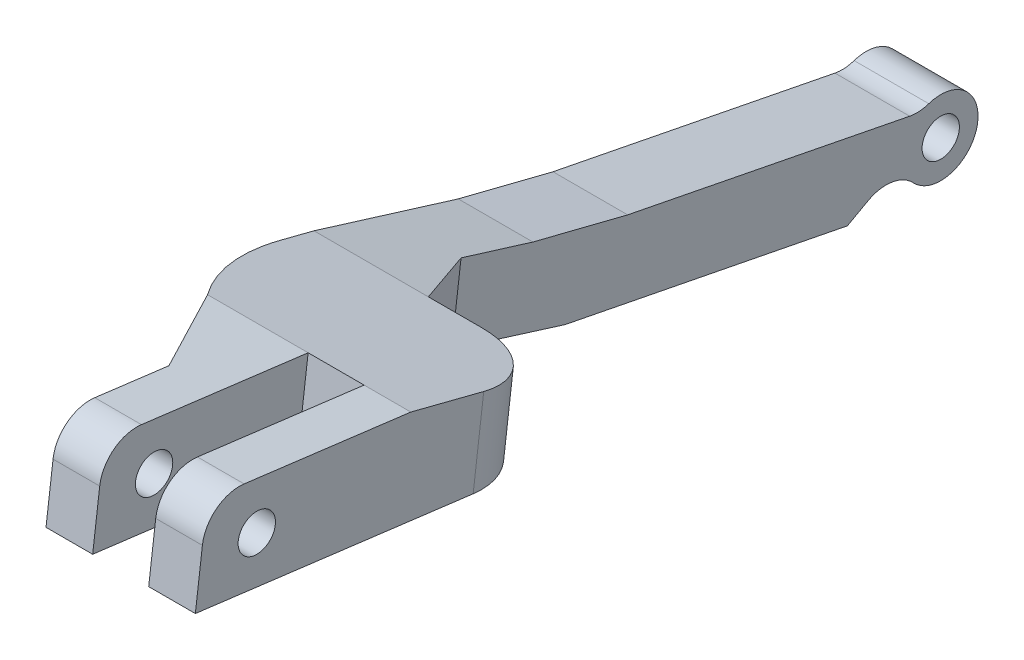
ISO-10303-21;
HEADER;
FILE_DESCRIPTION(('STEP AP214'),'2;1');
FILE_NAME('part.step','',(''),(''),'','','');
FILE_SCHEMA(('AUTOMOTIVE_DESIGN { 1 0 10303 214 1 1 1 1 }'));
ENDSEC;
DATA;
#1=APPLICATION_CONTEXT('core data for automotive mechanical design processes');
#2=APPLICATION_PROTOCOL_DEFINITION('international standard','automotive_design',2000,#1);
#3=PRODUCT_CONTEXT('',#1,'mechanical');
#4=PRODUCT('Part','Part','',(#3));
#5=PRODUCT_RELATED_PRODUCT_CATEGORY('part','',(#4));
#6=PRODUCT_DEFINITION_FORMATION('','',#4);
#7=PRODUCT_DEFINITION_CONTEXT('part definition',#1,'design');
#8=PRODUCT_DEFINITION('design','',#6,#7);
#9=PRODUCT_DEFINITION_SHAPE('','',#8);
#10=(LENGTH_UNIT() NAMED_UNIT(*) SI_UNIT(.MILLI.,.METRE.));
#11=(NAMED_UNIT(*) PLANE_ANGLE_UNIT() SI_UNIT($,.RADIAN.));
#12=(NAMED_UNIT(*) SI_UNIT($,.STERADIAN.) SOLID_ANGLE_UNIT());
#13=UNCERTAINTY_MEASURE_WITH_UNIT(LENGTH_MEASURE(1.E-05),#10,'distance_accuracy_value','');
#14=(GEOMETRIC_REPRESENTATION_CONTEXT(3) GLOBAL_UNCERTAINTY_ASSIGNED_CONTEXT((#13)) GLOBAL_UNIT_ASSIGNED_CONTEXT((#10,
#11,#12)) REPRESENTATION_CONTEXT('',''));
#15=CARTESIAN_POINT('',(0.,0.,0.));
#16=DIRECTION('',(0.,0.,1.));
#17=DIRECTION('',(1.,0.,0.));
#18=AXIS2_PLACEMENT_3D('',#15,#16,#17);
#19=CARTESIAN_POINT('',(-2.,8.91012961938462,24.670883087802));
#20=DIRECTION('',(0.,-0.96968688280219,0.244350873379597));
#21=DIRECTION('',(-1.,0.,0.));
#22=AXIS2_PLACEMENT_3D('',#19,#20,#21);
#23=PLANE('',#22);
#24=DIRECTION('',(-1.,0.,0.));
#25=VECTOR('',#24,1.);
#26=CARTESIAN_POINT('',(-2.,8.91012961938462,24.670883087802));
#27=LINE('',#26,#25);
#28=CARTESIAN_POINT('',(2.,8.91012961938464,24.6708830878021));
#29=VERTEX_POINT('',#28);
#30=CARTESIAN_POINT('',(-2.,8.91012961938464,24.6708830878021));
#31=VERTEX_POINT('',#30);
#32=EDGE_CURVE('E336',#29,#31,#27,.T.);
#33=ORIENTED_EDGE('',*,*,#32,.F.);
#34=DIRECTION('',(0.,0.244350873379597,0.96968688280219));
#35=VECTOR('',#34,1.);
#36=CARTESIAN_POINT('',(2.,8.91012961938462,24.670883087802));
#37=LINE('',#36,#35);
#38=CARTESIAN_POINT('',(2.,7.63129595767274,19.5959340610332));
#39=VERTEX_POINT('',#38);
#40=EDGE_CURVE('E363',#29,#39,#37,.F.);
#41=ORIENTED_EDGE('',*,*,#40,.T.);
#42=DIRECTION('',(1.,0.,0.));
#43=VECTOR('',#42,1.);
#44=CARTESIAN_POINT('',(-2.,7.63129595767269,19.595934061033));
#45=LINE('',#44,#43);
#46=CARTESIAN_POINT('',(-2.,7.63129595767274,19.5959340610332));
#47=VERTEX_POINT('',#46);
#48=EDGE_CURVE('E360',#47,#39,#45,.T.);
#49=ORIENTED_EDGE('',*,*,#48,.F.);
#50=DIRECTION('',(0.,-0.244350873379597,-0.96968688280219));
#51=VECTOR('',#50,1.);
#52=CARTESIAN_POINT('',(-2.,2.53251570366978,-0.638167263076703));
#53=LINE('',#52,#51);
#54=EDGE_CURVE('E365',#47,#31,#53,.F.);
#55=ORIENTED_EDGE('',*,*,#54,.T.);
#56=EDGE_LOOP('',(#33,#41,#49,#55));
#57=FACE_BOUND('',#56,.T.);
#58=ADVANCED_FACE('F42',(#57),#23,.F.);
#59=CARTESIAN_POINT('',(-2.,6.61866348231801,4.10674960117403));
#60=DIRECTION('',(1.,0.,0.));
#61=DIRECTION('',(0.,0.,-1.));
#62=AXIS2_PLACEMENT_3D('',#59,#60,#61);
#63=CYLINDRICAL_SURFACE('',#62,2.);
#64=DIRECTION('',(1.,0.,0.));
#65=VECTOR('',#64,1.);
#66=CARTESIAN_POINT('',(-2.,4.65637088782305,4.49328261863853));
#67=LINE('',#66,#65);
#68=CARTESIAN_POINT('',(-2.,4.65637088782305,4.49328261863853));
#69=VERTEX_POINT('',#68);
#70=CARTESIAN_POINT('',(2.,4.65637088782305,4.49328261863853));
#71=VERTEX_POINT('',#70);
#72=EDGE_CURVE('E333',#69,#71,#67,.T.);
#73=ORIENTED_EDGE('',*,*,#72,.T.);
#74=CARTESIAN_POINT('',(2.,6.61866348231801,4.10674960117403));
#75=DIRECTION('',(1.,0.,0.));
#76=DIRECTION('',(0.,0.,-1.));
#77=AXIS2_PLACEMENT_3D('',#74,#75,#76);
#78=CIRCLE('',#77,2.);
#79=CARTESIAN_POINT('',(2.,4.72354530353209,3.46758836296012));
#80=VERTEX_POINT('',#79);
#81=EDGE_CURVE('E279',#71,#80,#78,.T.);
#82=ORIENTED_EDGE('',*,*,#81,.T.);
#83=DIRECTION('',(1.,0.,0.));
#84=VECTOR('',#83,1.);
#85=CARTESIAN_POINT('',(-2.,4.72354530353209,3.46758836296012));
#86=LINE('',#85,#84);
#87=CARTESIAN_POINT('',(-2.,4.72354530353209,3.46758836296012));
#88=VERTEX_POINT('',#87);
#89=EDGE_CURVE('E334',#88,#80,#86,.T.);
#90=ORIENTED_EDGE('',*,*,#89,.F.);
#91=CARTESIAN_POINT('',(-2.,6.61866348231801,4.10674960117403));
#92=DIRECTION('',(1.,0.,0.));
#93=DIRECTION('',(0.,0.,-1.));
#94=AXIS2_PLACEMENT_3D('',#91,#92,#93);
#95=CIRCLE('',#94,2.);
#96=EDGE_CURVE('E304',#69,#88,#95,.T.);
#97=ORIENTED_EDGE('',*,*,#96,.F.);
#98=EDGE_LOOP('',(#73,#82,#90,#97));
#99=FACE_BOUND('',#98,.T.);
#100=ADVANCED_FACE('F456',(#99),#63,.F.);
#101=CARTESIAN_POINT('',(-2.,2.82842712474617,2.82842712474621));
#102=DIRECTION('',(1.,0.,0.));
#103=DIRECTION('',(0.,0.,-1.));
#104=AXIS2_PLACEMENT_3D('',#101,#102,#103);
#105=CYLINDRICAL_SURFACE('',#104,2.);
#106=ORIENTED_EDGE('',*,*,#89,.T.);
#107=CARTESIAN_POINT('',(2.,2.82842712474617,2.82842712474621));
#108=DIRECTION('',(1.,0.,0.));
#109=DIRECTION('',(0.,0.,-1.));
#110=AXIS2_PLACEMENT_3D('',#107,#108,#109);
#111=CIRCLE('',#110,2.);
#112=CARTESIAN_POINT('',(2.,1.46299909190755,4.28979849682739));
#113=VERTEX_POINT('',#112);
#114=EDGE_CURVE('E298',#113,#80,#111,.T.);
#115=ORIENTED_EDGE('',*,*,#114,.F.);
#116=DIRECTION('',(1.,0.,0.));
#117=VECTOR('',#116,1.);
#118=CARTESIAN_POINT('',(-2.,1.46299909190755,4.28979849682739));
#119=LINE('',#118,#117);
#120=CARTESIAN_POINT('',(-2.,1.46299909190755,4.28979849682739));
#121=VERTEX_POINT('',#120);
#122=EDGE_CURVE('E337',#121,#113,#119,.T.);
#123=ORIENTED_EDGE('',*,*,#122,.F.);
#124=CARTESIAN_POINT('',(-2.,2.82842712474617,2.82842712474621));
#125=DIRECTION('',(1.,0.,0.));
#126=DIRECTION('',(0.,0.,-1.));
#127=AXIS2_PLACEMENT_3D('',#124,#125,#126);
#128=CIRCLE('',#127,2.);
#129=EDGE_CURVE('E327',#121,#88,#128,.T.);
#130=ORIENTED_EDGE('',*,*,#129,.T.);
#131=EDGE_LOOP('',(#106,#115,#123,#130));
#132=FACE_BOUND('',#131,.T.);
#133=ADVANCED_FACE('F462',(#132),#105,.T.);
#134=CARTESIAN_POINT('',(-2.,0.0975710590689309,5.75116986890858));
#135=DIRECTION('',(1.,0.,0.));
#136=DIRECTION('',(0.,0.,-1.));
#137=AXIS2_PLACEMENT_3D('',#134,#135,#136);
#138=CYLINDRICAL_SURFACE('',#137,2.);
#139=ORIENTED_EDGE('',*,*,#122,.T.);
#140=CARTESIAN_POINT('',(2.,0.0975710590689309,5.75116986890858));
#141=DIRECTION('',(1.,0.,0.));
#142=DIRECTION('',(0.,0.,-1.));
#143=AXIS2_PLACEMENT_3D('',#140,#141,#142);
#144=CIRCLE('',#143,2.);
#145=CARTESIAN_POINT('',(2.,1.84923303121626,6.71640576511889));
#146=VERTEX_POINT('',#145);
#147=EDGE_CURVE('E295',#113,#146,#144,.T.);
#148=ORIENTED_EDGE('',*,*,#147,.T.);
#149=DIRECTION('',(1.,0.,0.));
#150=VECTOR('',#149,1.);
#151=CARTESIAN_POINT('',(-2.,1.84923303121626,6.71640576511889));
#152=LINE('',#151,#150);
#153=CARTESIAN_POINT('',(-2.,1.84923303121626,6.71640576511889));
#154=VERTEX_POINT('',#153);
#155=EDGE_CURVE('E339',#154,#146,#152,.T.);
#156=ORIENTED_EDGE('',*,*,#155,.F.);
#157=CARTESIAN_POINT('',(-2.,0.0975710590689309,5.75116986890858));
#158=DIRECTION('',(1.,0.,0.));
#159=DIRECTION('',(0.,0.,-1.));
#160=AXIS2_PLACEMENT_3D('',#157,#158,#159);
#161=CIRCLE('',#160,2.);
#162=EDGE_CURVE('E325',#121,#154,#161,.T.);
#163=ORIENTED_EDGE('',*,*,#162,.F.);
#164=EDGE_LOOP('',(#139,#148,#156,#163));
#165=FACE_BOUND('',#164,.T.);
#166=ADVANCED_FACE('F559',(#165),#138,.F.);
#167=CARTESIAN_POINT('',(-2.,4.25747884786671,2.34604134625321));
#168=DIRECTION('',(0.,-0.875830986073665,-0.482617948105156));
#169=DIRECTION('',(0.,0.482617948105156,-0.875830986073665));
#170=AXIS2_PLACEMENT_3D('',#167,#168,#169);
#171=PLANE('',#170);
#172=ORIENTED_EDGE('',*,*,#155,.T.);
#173=DIRECTION('',(0.,0.482617948105156,-0.875830986073665));
#174=VECTOR('',#173,1.);
#175=CARTESIAN_POINT('',(2.,4.25747884786671,2.34604134625321));
#176=LINE('',#175,#174);
#177=CARTESIAN_POINT('',(2.,1.23646472846601,7.8284271247462));
#178=VERTEX_POINT('',#177);
#179=EDGE_CURVE('E292',#178,#146,#176,.T.);
#180=ORIENTED_EDGE('',*,*,#179,.F.);
#181=DIRECTION('',(1.,0.,0.));
#182=VECTOR('',#181,1.);
#183=CARTESIAN_POINT('',(-2.,1.23646472846601,7.8284271247462));
#184=LINE('',#183,#182);
#185=CARTESIAN_POINT('',(-2.,1.23646472846601,7.8284271247462));
#186=VERTEX_POINT('',#185);
#187=EDGE_CURVE('E341',#186,#178,#184,.T.);
#188=ORIENTED_EDGE('',*,*,#187,.F.);
#189=DIRECTION('',(0.,0.482617948105156,-0.875830986073665));
#190=VECTOR('',#189,1.);
#191=CARTESIAN_POINT('',(-2.,4.25747884786671,2.34604134625321));
#192=LINE('',#191,#190);
#193=EDGE_CURVE('E322',#186,#154,#192,.T.);
#194=ORIENTED_EDGE('',*,*,#193,.T.);
#195=EDGE_LOOP('',(#172,#180,#188,#194));
#196=FACE_BOUND('',#195,.T.);
#197=ADVANCED_FACE('F563',(#196),#171,.T.);
#198=CARTESIAN_POINT('',(-2.,-0.294167272296382,0.0579451625710728));
#199=DIRECTION('',(0.,0.981146297247483,-0.193266508732252));
#200=DIRECTION('',(0.,0.193266508732252,0.981146297247483));
#201=AXIS2_PLACEMENT_3D('',#198,#199,#200);
#202=PLANE('',#201);
#203=ORIENTED_EDGE('',*,*,#187,.T.);
#204=DIRECTION('',(0.,0.193266508732252,0.981146297247483));
#205=VECTOR('',#204,1.);
#206=CARTESIAN_POINT('',(2.,-0.294167272296382,0.0579451625710728));
#207=LINE('',#206,#205);
#208=CARTESIAN_POINT('',(2.,4.21314419530496,22.939985025488));
#209=VERTEX_POINT('',#208);
#210=EDGE_CURVE('E289',#178,#209,#207,.T.);
#211=ORIENTED_EDGE('',*,*,#210,.T.);
#212=DIRECTION('',(1.,0.,0.));
#213=VECTOR('',#212,1.);
#214=CARTESIAN_POINT('',(-2.,4.21314419530496,22.939985025488));
#215=LINE('',#214,#213);
#216=CARTESIAN_POINT('',(-2.,4.21314419530496,22.939985025488));
#217=VERTEX_POINT('',#216);
#218=EDGE_CURVE('E343',#217,#209,#215,.T.);
#219=ORIENTED_EDGE('',*,*,#218,.F.);
#220=DIRECTION('',(0.,0.193266508732252,0.981146297247483));
#221=VECTOR('',#220,1.);
#222=CARTESIAN_POINT('',(-2.,-0.294167272296382,0.0579451625710728));
#223=LINE('',#222,#221);
#224=EDGE_CURVE('E320',#186,#217,#223,.T.);
#225=ORIENTED_EDGE('',*,*,#224,.F.);
#226=EDGE_LOOP('',(#203,#211,#219,#225));
#227=FACE_BOUND('',#226,.T.);
#228=ADVANCED_FACE('F567',(#227),#202,.F.);
#229=CARTESIAN_POINT('',(-2.,-2.6917735342892,0.841057785244844));
#230=DIRECTION('',(0.,-0.954492237339699,0.298235760528907));
#231=DIRECTION('',(0.,-0.298235760528907,-0.954492237339699));
#232=AXIS2_PLACEMENT_3D('',#229,#230,#231);
#233=PLANE('',#232);
#234=ORIENTED_EDGE('',*,*,#218,.T.);
#235=DIRECTION('',(0.,-0.298235760528907,-0.954492237339699));
#236=VECTOR('',#235,1.);
#237=CARTESIAN_POINT('',(2.,-2.6917735342892,0.841057785244844));
#238=LINE('',#237,#236);
#239=CARTESIAN_POINT('',(2.,6.11486564630135,29.0263723833934));
#240=VERTEX_POINT('',#239);
#241=EDGE_CURVE('E287',#240,#209,#238,.T.);
#242=ORIENTED_EDGE('',*,*,#241,.F.);
#243=DIRECTION('',(0.463734515213627,0.264229192095148,0.845655505181826));
#244=VECTOR('',#243,1.);
#245=CARTESIAN_POINT('',(3.90037678836741,7.19767274172614,32.4918554136189));
#246=LINE('',#245,#244);
#247=CARTESIAN_POINT('',(4.12683772664592,7.32670689553476,32.9048243276874));
#248=VERTEX_POINT('',#247);
#249=EDGE_CURVE('E374',#240,#248,#246,.T.);
#250=ORIENTED_EDGE('',*,*,#249,.T.);
#251=DIRECTION('',(1.,0.,0.));
#252=VECTOR('',#251,1.);
#253=CARTESIAN_POINT('',(-2.,7.32670689553476,32.9048243276874));
#254=LINE('',#253,#252);
#255=CARTESIAN_POINT('',(-2.,7.32670689553476,32.9048243276874));
#256=VERTEX_POINT('',#255);
#257=EDGE_CURVE('E346',#256,#248,#254,.T.);
#258=ORIENTED_EDGE('',*,*,#257,.F.);
#259=DIRECTION('',(0.,-0.298235760528907,-0.954492237339699));
#260=VECTOR('',#259,1.);
#261=CARTESIAN_POINT('',(-2.,-2.6917735342892,0.841057785244844));
#262=LINE('',#261,#260);
#263=EDGE_CURVE('E317',#256,#217,#262,.T.);
#264=ORIENTED_EDGE('',*,*,#263,.T.);
#265=EDGE_LOOP('',(#234,#242,#250,#258,#264));
#266=FACE_BOUND('',#265,.T.);
#267=ADVANCED_FACE('F571',(#266),#233,.T.);
#268=CARTESIAN_POINT('',(-2.,3.10844437122084,-0.393777328413223));
#269=DIRECTION('',(0.,0.992071405988874,-0.125675476602471));
#270=DIRECTION('',(0.,0.125675476602471,0.992071405988874));
#271=AXIS2_PLACEMENT_3D('',#268,#269,#270);
#272=PLANE('',#271);
#273=DIRECTION('',(-1.,0.,0.));
#274=VECTOR('',#273,1.);
#275=CARTESIAN_POINT('',(11.,7.32670689553476,32.9048243276874));
#276=LINE('',#275,#274);
#277=CARTESIAN_POINT('',(7.,7.32670689553476,32.9048243276874));
#278=VERTEX_POINT('',#277);
#279=EDGE_CURVE('E277',#278,#248,#276,.T.);
#280=ORIENTED_EDGE('',*,*,#279,.F.);
#281=CARTESIAN_POINT('',(7.,7.82940880194464,36.8731099516429));
#282=DIRECTION('',(0.,0.992071405988874,-0.125675476602471));
#283=DIRECTION('',(0.,0.125675476602471,0.992071405988874));
#284=AXIS2_PLACEMENT_3D('',#281,#282,#283);
#285=CIRCLE('',#284,4.);
#286=CARTESIAN_POINT('',(11.,7.82940880194465,36.8731099516429));
#287=VERTEX_POINT('',#286);
#288=EDGE_CURVE('E12',#278,#287,#285,.F.);
#289=ORIENTED_EDGE('',*,*,#288,.T.);
#290=DIRECTION('',(0.,-0.125675476602471,-0.992071405988874));
#291=VECTOR('',#290,1.);
#292=CARTESIAN_POINT('',(11.,3.10844437122084,-0.393777328413223));
#293=LINE('',#292,#291);
#294=CARTESIAN_POINT('',(11.,9.71454095098172,51.754181041476));
#295=VERTEX_POINT('',#294);
#296=EDGE_CURVE('E272',#295,#287,#293,.T.);
#297=ORIENTED_EDGE('',*,*,#296,.F.);
#298=DIRECTION('',(1.,0.,0.));
#299=VECTOR('',#298,1.);
#300=CARTESIAN_POINT('',(8.5,9.71454095098172,51.754181041476));
#301=LINE('',#300,#299);
#302=CARTESIAN_POINT('',(8.5,9.71454095098172,51.754181041476));
#303=VERTEX_POINT('',#302);
#304=EDGE_CURVE('E264',#303,#295,#301,.T.);
#305=ORIENTED_EDGE('',*,*,#304,.F.);
#306=DIRECTION('',(0.,0.125675476602472,0.992071405988874));
#307=VECTOR('',#306,1.);
#308=CARTESIAN_POINT('',(8.5,3.10844437122082,-0.393777328413222));
#309=LINE('',#308,#307);
#310=CARTESIAN_POINT('',(8.5,8.33211070835453,40.8413955755984));
#311=VERTEX_POINT('',#310);
#312=EDGE_CURVE('E249',#311,#303,#309,.T.);
#313=ORIENTED_EDGE('',*,*,#312,.F.);
#314=DIRECTION('',(1.,0.,0.));
#315=VECTOR('',#314,1.);
#316=CARTESIAN_POINT('',(-2.,8.33211070835453,40.8413955755984));
#317=LINE('',#316,#315);
#318=CARTESIAN_POINT('',(5.5,8.33211070835453,40.8413955755984));
#319=VERTEX_POINT('',#318);
#320=EDGE_CURVE('E349',#319,#311,#317,.T.);
#321=ORIENTED_EDGE('',*,*,#320,.F.);
#322=DIRECTION('',(0.,0.125675476602472,0.992071405988874));
#323=VECTOR('',#322,1.);
#324=CARTESIAN_POINT('',(5.5,3.10844437122082,-0.393777328413222));
#325=LINE('',#324,#323);
#326=CARTESIAN_POINT('',(5.5,9.71454095098172,51.754181041476));
#327=VERTEX_POINT('',#326);
#328=EDGE_CURVE('E230',#319,#327,#325,.T.);
#329=ORIENTED_EDGE('',*,*,#328,.T.);
#330=DIRECTION('',(1.,0.,0.));
#331=VECTOR('',#330,1.);
#332=CARTESIAN_POINT('',(3.,9.71454095098172,51.754181041476));
#333=LINE('',#332,#331);
#334=CARTESIAN_POINT('',(3.,9.71454095098172,51.754181041476));
#335=VERTEX_POINT('',#334);
#336=EDGE_CURVE('E223',#335,#327,#333,.T.);
#337=ORIENTED_EDGE('',*,*,#336,.F.);
#338=DIRECTION('',(0.,0.125675476602472,0.992071405988874));
#339=VECTOR('',#338,1.);
#340=CARTESIAN_POINT('',(3.,3.10844437122082,-0.393777328413222));
#341=LINE('',#340,#339);
#342=CARTESIAN_POINT('',(3.,8.96048809136689,45.8017526055427));
#343=VERTEX_POINT('',#342);
#344=EDGE_CURVE('E204',#343,#335,#341,.T.);
#345=ORIENTED_EDGE('',*,*,#344,.F.);
#346=DIRECTION('',(-0.500000000000004,-0.108838155370457,-0.859159039954508));
#347=VECTOR('',#346,1.);
#348=CARTESIAN_POINT('',(-18.4131163959478,4.29935991283123,9.00720755518965));
#349=LINE('',#348,#347);
#350=CARTESIAN_POINT('',(0.113248654051862,8.33211070835453,40.8413955755984));
#351=VERTEX_POINT('',#350);
#352=EDGE_CURVE('E384',#343,#351,#349,.T.);
#353=ORIENTED_EDGE('',*,*,#352,.T.);
#354=CARTESIAN_POINT('',(8.,7.55944511035842,34.7420397833152));
#355=DIRECTION('',(0.,0.992071405988874,-0.125675476602471));
#356=DIRECTION('',(0.,0.125675476602471,0.992071405988874));
#357=AXIS2_PLACEMENT_3D('',#354,#355,#356);
#358=CIRCLE('',#357,10.);
#359=CARTESIAN_POINT('',(-2.,7.55944511035842,34.7420397833152));
#360=VERTEX_POINT('',#359);
#361=EDGE_CURVE('E386',#351,#360,#358,.F.);
#362=ORIENTED_EDGE('',*,*,#361,.T.);
#363=DIRECTION('',(0.,0.125675476602471,0.992071405988874));
#364=VECTOR('',#363,1.);
#365=CARTESIAN_POINT('',(-2.,3.10844437122084,-0.393777328413223));
#366=LINE('',#365,#364);
#367=EDGE_CURVE('E314',#256,#360,#366,.T.);
#368=ORIENTED_EDGE('',*,*,#367,.F.);
#369=ORIENTED_EDGE('',*,*,#257,.T.);
#370=EDGE_LOOP('',(#280,#289,#297,#305,#313,#321,#329,#337,#345,#353,#362,#368,#369));
#371=FACE_BOUND('',#370,.T.);
#372=ADVANCED_FACE('F228',(#371),#272,.F.);
#373=CARTESIAN_POINT('',(-2.,5.2236663371337,41.2351729040116));
#374=DIRECTION('',(0.,0.125675476602471,0.992071405988874));
#375=DIRECTION('',(0.,-0.992071405988874,0.125675476602471));
#376=AXIS2_PLACEMENT_3D('',#373,#374,#375);
#377=PLANE('',#376);
#378=DIRECTION('',(0.,0.992071405988874,-0.125675476602471));
#379=VECTOR('',#378,1.);
#380=CARTESIAN_POINT('',(5.5,5.2236663371337,41.2351729040116));
#381=LINE('',#380,#379);
#382=CARTESIAN_POINT('',(5.5,13.2924677382989,40.213018192586));
#383=VERTEX_POINT('',#382);
#384=EDGE_CURVE('E232',#319,#383,#381,.T.);
#385=ORIENTED_EDGE('',*,*,#384,.F.);
#386=ORIENTED_EDGE('',*,*,#320,.T.);
#387=DIRECTION('',(0.,-0.992071405988874,0.125675476602471));
#388=VECTOR('',#387,1.);
#389=CARTESIAN_POINT('',(8.5,5.2236663371337,41.2351729040116));
#390=LINE('',#389,#388);
#391=CARTESIAN_POINT('',(8.5,13.2924677382989,40.213018192586));
#392=VERTEX_POINT('',#391);
#393=EDGE_CURVE('E267',#392,#311,#390,.T.);
#394=ORIENTED_EDGE('',*,*,#393,.F.);
#395=DIRECTION('',(1.,0.,0.));
#396=VECTOR('',#395,1.);
#397=CARTESIAN_POINT('',(-2.,13.2924677382989,40.213018192586));
#398=LINE('',#397,#396);
#399=EDGE_CURVE('E351',#383,#392,#398,.T.);
#400=ORIENTED_EDGE('',*,*,#399,.F.);
#401=EDGE_LOOP('',(#385,#386,#394,#400));
#402=FACE_BOUND('',#401,.T.);
#403=ADVANCED_FACE('F430',(#402),#377,.T.);
#404=CARTESIAN_POINT('',(-2.,2.82412823212629,-0.722212448299654));
#405=DIRECTION('',(0.,-0.968822383898223,0.247756308613452));
#406=DIRECTION('',(0.,-0.247756308613452,-0.968822383898223));
#407=AXIS2_PLACEMENT_3D('',#404,#405,#406);
#408=PLANE('',#407);
#409=DIRECTION('',(0.,0.247756308613452,0.968822383898223));
#410=VECTOR('',#409,1.);
#411=CARTESIAN_POINT('',(11.,2.82412823212629,-0.722212448299654));
#412=LINE('',#411,#410);
#413=CARTESIAN_POINT('',(11.,12.2937301288946,36.3075703069318));
#414=VERTEX_POINT('',#413);
#415=CARTESIAN_POINT('',(11.,13.2924677382989,40.213018192586));
#416=VERTEX_POINT('',#415);
#417=EDGE_CURVE('E270',#414,#416,#412,.T.);
#418=ORIENTED_EDGE('',*,*,#417,.F.);
#419=CARTESIAN_POINT('',(7.,12.2937301288946,36.3075703069318));
#420=DIRECTION('',(0.,-0.968822383898223,0.247756308613452));
#421=DIRECTION('',(0.,0.247756308613452,0.968822383898223));
#422=AXIS2_PLACEMENT_3D('',#419,#420,#421);
#423=ELLIPSE('',#422,4.03112887414927,4.);
#424=CARTESIAN_POINT('',(7.,11.2949925194903,32.4021224212775));
#425=VERTEX_POINT('',#424);
#426=EDGE_CURVE('E64',#414,#425,#423,.F.);
#427=ORIENTED_EDGE('',*,*,#426,.T.);
#428=DIRECTION('',(-1.,0.,0.));
#429=VECTOR('',#428,1.);
#430=CARTESIAN_POINT('',(11.,11.2949925194903,32.4021224212775));
#431=LINE('',#430,#429);
#432=CARTESIAN_POINT('',(4.12683772664592,11.2949925194903,32.4021224212775));
#433=VERTEX_POINT('',#432);
#434=EDGE_CURVE('E275',#425,#433,#431,.T.);
#435=ORIENTED_EDGE('',*,*,#434,.T.);
#436=DIRECTION('',(1.,0.,0.));
#437=VECTOR('',#436,1.);
#438=CARTESIAN_POINT('',(-2.,11.2949925194903,32.4021224212775));
#439=LINE('',#438,#437);
#440=CARTESIAN_POINT('',(-2.,11.2949925194903,32.4021224212775));
#441=VERTEX_POINT('',#440);
#442=EDGE_CURVE('E354',#441,#433,#439,.T.);
#443=ORIENTED_EDGE('',*,*,#442,.F.);
#444=DIRECTION('',(0.,-0.247756308613452,-0.968822383898223));
#445=VECTOR('',#444,1.);
#446=CARTESIAN_POINT('',(-2.,2.82412823212629,-0.722212448299654));
#447=LINE('',#446,#445);
#448=CARTESIAN_POINT('',(-2.,11.7573826662674,34.2102456000523));
#449=VERTEX_POINT('',#448);
#450=EDGE_CURVE('E312',#449,#441,#447,.T.);
#451=ORIENTED_EDGE('',*,*,#450,.F.);
#452=CARTESIAN_POINT('',(8.,11.7573826662674,34.2102456000523));
#453=DIRECTION('',(0.,-0.968822383898223,0.247756308613452));
#454=DIRECTION('',(0.,0.247756308613452,0.968822383898223));
#455=AXIS2_PLACEMENT_3D('',#452,#453,#454);
#456=ELLIPSE('',#455,10.0778221853732,10.);
#457=CARTESIAN_POINT('',(0.113248654051862,13.2924677382989,40.213018192586));
#458=VERTEX_POINT('',#457);
#459=EDGE_CURVE('E390',#449,#458,#456,.F.);
#460=ORIENTED_EDGE('',*,*,#459,.T.);
#461=DIRECTION('',(1.,0.,0.));
#462=VECTOR('',#461,1.);
#463=CARTESIAN_POINT('',(3.,13.2924677382989,40.213018192586));
#464=LINE('',#463,#462);
#465=EDGE_CURVE('E226',#458,#383,#464,.T.);
#466=ORIENTED_EDGE('',*,*,#465,.T.);
#467=ORIENTED_EDGE('',*,*,#399,.T.);
#468=DIRECTION('',(1.,0.,0.));
#469=VECTOR('',#468,1.);
#470=CARTESIAN_POINT('',(8.5,13.2924677382989,40.213018192586));
#471=LINE('',#470,#469);
#472=EDGE_CURVE('E257',#392,#416,#471,.T.);
#473=ORIENTED_EDGE('',*,*,#472,.T.);
#474=EDGE_LOOP('',(#418,#427,#435,#443,#451,#460,#466,#467,#473));
#475=FACE_BOUND('',#474,.T.);
#476=ADVANCED_FACE('F420',(#475),#408,.F.);
#477=CARTESIAN_POINT('',(-2.,1.18693623720309,-0.366135372971844));
#478=DIRECTION('',(0.,-0.955569624013244,0.294765489267634));
#479=DIRECTION('',(0.,-0.294765489267634,-0.955569624013244));
#480=AXIS2_PLACEMENT_3D('',#477,#478,#479);
#481=PLANE('',#480);
#482=ORIENTED_EDGE('',*,*,#442,.T.);
#483=DIRECTION('',(-0.463968429487719,-0.261118520091878,-0.846493009364949));
#484=VECTOR('',#483,1.);
#485=CARTESIAN_POINT('',(-11.2862682588212,2.62059320876953,4.28148825721453));
#486=LINE('',#485,#484);
#487=CARTESIAN_POINT('',(2.,10.0980215956915,28.5217867060927));
#488=VERTEX_POINT('',#487);
#489=EDGE_CURVE('E372',#433,#488,#486,.T.);
#490=ORIENTED_EDGE('',*,*,#489,.T.);
#491=DIRECTION('',(0.,-0.294765489267634,-0.955569624013244));
#492=VECTOR('',#491,1.);
#493=CARTESIAN_POINT('',(2.,1.18693623720309,-0.366135372971844));
#494=LINE('',#493,#492);
#495=EDGE_CURVE('E285',#488,#29,#494,.T.);
#496=ORIENTED_EDGE('',*,*,#495,.T.);
#497=ORIENTED_EDGE('',*,*,#32,.T.);
#498=DIRECTION('',(0.,-0.294765489267634,-0.955569624013244));
#499=VECTOR('',#498,1.);
#500=CARTESIAN_POINT('',(-2.,1.18693623720309,-0.366135372971844));
#501=LINE('',#500,#499);
#502=EDGE_CURVE('E309',#441,#31,#501,.T.);
#503=ORIENTED_EDGE('',*,*,#502,.F.);
#504=EDGE_LOOP('',(#482,#490,#496,#497,#503));
#505=FACE_BOUND('',#504,.T.);
#506=ADVANCED_FACE('F582',(#505),#481,.F.);
#507=CARTESIAN_POINT('',(-2.,3.63041791669355,-0.715120872357937));
#508=DIRECTION('',(0.,0.981146297247483,-0.193266508732252));
#509=DIRECTION('',(0.,0.193266508732252,0.981146297247483));
#510=AXIS2_PLACEMENT_3D('',#507,#508,#509);
#511=PLANE('',#510);
#512=DIRECTION('',(0.,0.193266508732252,0.981146297247483));
#513=VECTOR('',#512,1.);
#514=CARTESIAN_POINT('',(-2.,3.63041791669355,-0.715120872357937));
#515=LINE('',#514,#513);
#516=EDGE_CURVE('E306',#69,#47,#515,.T.);
#517=ORIENTED_EDGE('',*,*,#516,.T.);
#518=ORIENTED_EDGE('',*,*,#48,.T.);
#519=DIRECTION('',(0.,0.193266508732252,0.981146297247483));
#520=VECTOR('',#519,1.);
#521=CARTESIAN_POINT('',(2.,3.63041791669355,-0.715120872357937));
#522=LINE('',#521,#520);
#523=EDGE_CURVE('E282',#71,#39,#522,.T.);
#524=ORIENTED_EDGE('',*,*,#523,.F.);
#525=ORIENTED_EDGE('',*,*,#72,.F.);
#526=EDGE_LOOP('',(#517,#518,#524,#525));
#527=FACE_BOUND('',#526,.T.);
#528=ADVANCED_FACE('F555',(#527),#511,.T.);
#529=CARTESIAN_POINT('',(-2.,2.82842712474617,2.82842712474621));
#530=DIRECTION('',(1.,0.,0.));
#531=DIRECTION('',(0.,0.,-1.));
#532=AXIS2_PLACEMENT_3D('',#529,#530,#531);
#533=CYLINDRICAL_SURFACE('',#532,1.);
#534=CARTESIAN_POINT('',(-2.,2.82842712474617,2.82842712474621));
#535=DIRECTION('',(1.,0.,0.));
#536=DIRECTION('',(0.,0.,-1.));
#537=AXIS2_PLACEMENT_3D('',#534,#535,#536);
#538=CIRCLE('',#537,1.);
#539=CARTESIAN_POINT('',(-2.,2.82842712474617,1.82842712474621));
#540=VERTEX_POINT('',#539);
#541=EDGE_CURVE('E330',#540,#540,#538,.T.);
#542=ORIENTED_EDGE('',*,*,#541,.F.);
#543=EDGE_LOOP('',(#542));
#544=FACE_BOUND('',#543,.T.);
#545=CARTESIAN_POINT('',(2.,2.82842712474617,2.82842712474621));
#546=DIRECTION('',(1.,0.,0.));
#547=DIRECTION('',(0.,0.,-1.));
#548=AXIS2_PLACEMENT_3D('',#545,#546,#547);
#549=CIRCLE('',#548,1.);
#550=CARTESIAN_POINT('',(2.,2.82842712474617,1.82842712474621));
#551=VERTEX_POINT('',#550);
#552=EDGE_CURVE('E301',#551,#551,#549,.T.);
#553=ORIENTED_EDGE('',*,*,#552,.T.);
#554=EDGE_LOOP('',(#553));
#555=FACE_BOUND('',#554,.T.);
#556=ADVANCED_FACE('F552',(#544,#555),#533,.F.);
#557=CARTESIAN_POINT('',(-2.,0.,0.));
#558=DIRECTION('',(1.,0.,0.));
#559=DIRECTION('',(0.,0.,-1.));
#560=AXIS2_PLACEMENT_3D('',#557,#558,#559);
#561=PLANE('',#560);
#562=ORIENTED_EDGE('',*,*,#367,.T.);
#563=DIRECTION('',(0.,0.992071405988874,-0.125675476602472));
#564=VECTOR('',#563,1.);
#565=CARTESIAN_POINT('',(-2.,4.45100073913759,35.1358171117284));
#566=LINE('',#565,#564);
#567=EDGE_CURVE('E388',#360,#449,#566,.T.);
#568=ORIENTED_EDGE('',*,*,#567,.T.);
#569=ORIENTED_EDGE('',*,*,#450,.T.);
#570=ORIENTED_EDGE('',*,*,#502,.T.);
#571=ORIENTED_EDGE('',*,*,#54,.F.);
#572=ORIENTED_EDGE('',*,*,#516,.F.);
#573=ORIENTED_EDGE('',*,*,#96,.T.);
#574=ORIENTED_EDGE('',*,*,#129,.F.);
#575=ORIENTED_EDGE('',*,*,#162,.T.);
#576=ORIENTED_EDGE('',*,*,#193,.F.);
#577=ORIENTED_EDGE('',*,*,#224,.T.);
#578=ORIENTED_EDGE('',*,*,#263,.F.);
#579=EDGE_LOOP('',(#562,#568,#569,#570,#571,#572,#573,#574,#575,#576,#577,#578));
#580=FACE_BOUND('',#579,.T.);
#581=ORIENTED_EDGE('',*,*,#541,.T.);
#582=EDGE_LOOP('',(#581));
#583=FACE_BOUND('',#582,.T.);
#584=ADVANCED_FACE('F492',(#580,#583),#561,.F.);
#585=CARTESIAN_POINT('',(2.,0.,0.));
#586=DIRECTION('',(1.,0.,0.));
#587=DIRECTION('',(0.,0.,-1.));
#588=AXIS2_PLACEMENT_3D('',#585,#586,#587);
#589=PLANE('',#588);
#590=ORIENTED_EDGE('',*,*,#495,.F.);
#591=DIRECTION('',(0.,-0.992071405988874,0.125675476602473));
#592=VECTOR('',#591,1.);
#593=CARTESIAN_POINT('',(2.,3.71556061790409,29.3303160321451));
#594=LINE('',#593,#592);
#595=EDGE_CURVE('E370',#488,#240,#594,.T.);
#596=ORIENTED_EDGE('',*,*,#595,.T.);
#597=ORIENTED_EDGE('',*,*,#241,.T.);
#598=ORIENTED_EDGE('',*,*,#210,.F.);
#599=ORIENTED_EDGE('',*,*,#179,.T.);
#600=ORIENTED_EDGE('',*,*,#147,.F.);
#601=ORIENTED_EDGE('',*,*,#114,.T.);
#602=ORIENTED_EDGE('',*,*,#81,.F.);
#603=ORIENTED_EDGE('',*,*,#523,.T.);
#604=ORIENTED_EDGE('',*,*,#40,.F.);
#605=EDGE_LOOP('',(#590,#596,#597,#598,#599,#600,#601,#602,#603,#604));
#606=FACE_BOUND('',#605,.T.);
#607=ORIENTED_EDGE('',*,*,#552,.F.);
#608=EDGE_LOOP('',(#607));
#609=FACE_BOUND('',#608,.T.);
#610=ADVANCED_FACE('F546',(#606,#609),#589,.T.);
#611=CARTESIAN_POINT('',(11.,4.21826252431398,33.2986016561006));
#612=DIRECTION('',(0.,0.125675476602473,0.992071405988874));
#613=DIRECTION('',(0.,-0.992071405988874,0.125675476602473));
#614=AXIS2_PLACEMENT_3D('',#611,#612,#613);
#615=PLANE('',#614);
#616=ORIENTED_EDGE('',*,*,#434,.F.);
#617=DIRECTION('',(0.,0.992071405988874,-0.125675476602473));
#618=VECTOR('',#617,1.);
#619=CARTESIAN_POINT('',(7.,4.21826252431398,33.2986016561006));
#620=LINE('',#619,#618);
#621=EDGE_CURVE('E50',#425,#278,#620,.F.);
#622=ORIENTED_EDGE('',*,*,#621,.T.);
#623=ORIENTED_EDGE('',*,*,#279,.T.);
#624=DIRECTION('',(0.,0.992071405988874,-0.125675476602473));
#625=VECTOR('',#624,1.);
#626=CARTESIAN_POINT('',(4.12683772664592,4.21826252431398,33.2986016561006));
#627=LINE('',#626,#625);
#628=EDGE_CURVE('E367',#248,#433,#627,.T.);
#629=ORIENTED_EDGE('',*,*,#628,.T.);
#630=EDGE_LOOP('',(#616,#622,#623,#629));
#631=FACE_BOUND('',#630,.T.);
#632=ADVANCED_FACE('F543',(#631),#615,.F.);
#633=CARTESIAN_POINT('',(11.,0.,0.));
#634=DIRECTION('',(-1.,0.,0.));
#635=DIRECTION('',(0.,0.,1.));
#636=AXIS2_PLACEMENT_3D('',#633,#634,#635);
#637=PLANE('',#636);
#638=ORIENTED_EDGE('',*,*,#296,.T.);
#639=DIRECTION('',(0.,0.992071405988874,-0.125675476602473));
#640=VECTOR('',#639,1.);
#641=CARTESIAN_POINT('',(11.,4.72096443072387,37.2668872800561));
#642=LINE('',#641,#640);
#643=EDGE_CURVE('E409',#287,#414,#642,.T.);
#644=ORIENTED_EDGE('',*,*,#643,.T.);
#645=ORIENTED_EDGE('',*,*,#417,.T.);
#646=DIRECTION('',(0.,-0.125675476602472,-0.992071405988874));
#647=VECTOR('',#646,1.);
#648=CARTESIAN_POINT('',(11.,8.0688014011652,-1.02215471142558));
#649=LINE('',#648,#647);
#650=CARTESIAN_POINT('',(11.,14.4235470277211,49.1416608464859));
#651=VERTEX_POINT('',#650);
#652=EDGE_CURVE('E252',#651,#416,#649,.T.);
#653=ORIENTED_EDGE('',*,*,#652,.F.);
#654=CARTESIAN_POINT('',(11.,12.4394042157434,49.3930117996908));
#655=DIRECTION('',(-1.,0.,0.));
#656=DIRECTION('',(0.,0.,1.));
#657=AXIS2_PLACEMENT_3D('',#654,#655,#656);
#658=CIRCLE('',#657,2.);
#659=CARTESIAN_POINT('',(11.,12.6907551689483,51.3771546116686));
#660=VERTEX_POINT('',#659);
#661=EDGE_CURVE('E395',#651,#660,#658,.F.);
#662=ORIENTED_EDGE('',*,*,#661,.T.);
#663=DIRECTION('',(0.,0.992071405988874,-0.125675476602471));
#664=VECTOR('',#663,1.);
#665=CARTESIAN_POINT('',(11.,6.60609657976088,52.1479583698892));
#666=LINE('',#665,#664);
#667=EDGE_CURVE('E246',#295,#660,#666,.T.);
#668=ORIENTED_EDGE('',*,*,#667,.F.);
#669=EDGE_LOOP('',(#638,#644,#645,#653,#662,#668));
#670=FACE_BOUND('',#669,.T.);
#671=CARTESIAN_POINT('',(11.,11.8176930361465,48.4637781320032));
#672=DIRECTION('',(-1.,0.,0.));
#673=DIRECTION('',(0.,0.,1.));
#674=AXIS2_PLACEMENT_3D('',#671,#672,#673);
#675=CIRCLE('',#674,0.999999999999998);
#676=CARTESIAN_POINT('',(11.,11.8176930361465,47.4637781320032));
#677=VERTEX_POINT('',#676);
#678=EDGE_CURVE('E235',#677,#677,#675,.T.);
#679=ORIENTED_EDGE('',*,*,#678,.T.);
#680=EDGE_LOOP('',(#679));
#681=FACE_BOUND('',#680,.T.);
#682=ADVANCED_FACE('F414',(#670,#681),#637,.F.);
#683=CARTESIAN_POINT('',(8.5,0.,0.));
#684=DIRECTION('',(-1.,0.,0.));
#685=DIRECTION('',(0.,0.,1.));
#686=AXIS2_PLACEMENT_3D('',#683,#684,#685);
#687=PLANE('',#686);
#688=DIRECTION('',(0.,0.992071405988874,-0.125675476602471));
#689=VECTOR('',#688,1.);
#690=CARTESIAN_POINT('',(8.5,6.60609657976088,52.1479583698892));
#691=LINE('',#690,#689);
#692=CARTESIAN_POINT('',(8.5,12.6907551689483,51.3771546116686));
#693=VERTEX_POINT('',#692);
#694=EDGE_CURVE('E251',#303,#693,#691,.T.);
#695=ORIENTED_EDGE('',*,*,#694,.T.);
#696=CARTESIAN_POINT('',(8.5,12.4394042157434,49.3930117996908));
#697=DIRECTION('',(-1.,0.,0.));
#698=DIRECTION('',(0.,0.,1.));
#699=AXIS2_PLACEMENT_3D('',#696,#697,#698);
#700=CIRCLE('',#699,2.);
#701=CARTESIAN_POINT('',(8.5,14.4235470277211,49.1416608464859));
#702=VERTEX_POINT('',#701);
#703=EDGE_CURVE('E399',#693,#702,#700,.T.);
#704=ORIENTED_EDGE('',*,*,#703,.T.);
#705=DIRECTION('',(0.,-0.125675476602472,-0.992071405988874));
#706=VECTOR('',#705,1.);
#707=CARTESIAN_POINT('',(8.5,8.0688014011652,-1.02215471142558));
#708=LINE('',#707,#706);
#709=EDGE_CURVE('E255',#702,#392,#708,.T.);
#710=ORIENTED_EDGE('',*,*,#709,.T.);
#711=ORIENTED_EDGE('',*,*,#393,.T.);
#712=ORIENTED_EDGE('',*,*,#312,.T.);
#713=EDGE_LOOP('',(#695,#704,#710,#711,#712));
#714=FACE_BOUND('',#713,.T.);
#715=CARTESIAN_POINT('',(8.5,11.8176930361465,48.4637781320032));
#716=DIRECTION('',(-1.,0.,0.));
#717=DIRECTION('',(0.,0.,1.));
#718=AXIS2_PLACEMENT_3D('',#715,#716,#717);
#719=CIRCLE('',#718,0.999999999999998);
#720=CARTESIAN_POINT('',(8.5,11.8176930361465,47.4637781320032));
#721=VERTEX_POINT('',#720);
#722=EDGE_CURVE('E243',#721,#721,#719,.T.);
#723=ORIENTED_EDGE('',*,*,#722,.F.);
#724=EDGE_LOOP('',(#723));
#725=FACE_BOUND('',#724,.T.);
#726=ADVANCED_FACE('F433',(#714,#725),#687,.T.);
#727=CARTESIAN_POINT('',(8.5,6.60609657976088,52.1479583698892));
#728=DIRECTION('',(0.,-0.125675476602471,-0.992071405988874));
#729=DIRECTION('',(0.,0.992071405988874,-0.125675476602471));
#730=AXIS2_PLACEMENT_3D('',#727,#728,#729);
#731=PLANE('',#730);
#732=ORIENTED_EDGE('',*,*,#667,.T.);
#733=DIRECTION('',(1.,0.,0.));
#734=VECTOR('',#733,1.);
#735=CARTESIAN_POINT('',(8.5,12.6907551689483,51.3771546116686));
#736=LINE('',#735,#734);
#737=EDGE_CURVE('E397',#660,#693,#736,.F.);
#738=ORIENTED_EDGE('',*,*,#737,.T.);
#739=ORIENTED_EDGE('',*,*,#694,.F.);
#740=ORIENTED_EDGE('',*,*,#304,.T.);
#741=EDGE_LOOP('',(#732,#738,#739,#740));
#742=FACE_BOUND('',#741,.T.);
#743=ADVANCED_FACE('F438',(#742),#731,.F.);
#744=CARTESIAN_POINT('',(8.5,8.0688014011652,-1.02215471142558));
#745=DIRECTION('',(0.,-0.992071405988874,0.125675476602472));
#746=DIRECTION('',(0.,-0.125675476602472,-0.992071405988874));
#747=AXIS2_PLACEMENT_3D('',#744,#745,#746);
#748=PLANE('',#747);
#749=ORIENTED_EDGE('',*,*,#709,.F.);
#750=DIRECTION('',(1.,0.,0.));
#751=VECTOR('',#750,1.);
#752=CARTESIAN_POINT('',(8.5,14.4235470277211,49.1416608464859));
#753=LINE('',#752,#751);
#754=EDGE_CURVE('E392',#702,#651,#753,.T.);
#755=ORIENTED_EDGE('',*,*,#754,.T.);
#756=ORIENTED_EDGE('',*,*,#652,.T.);
#757=ORIENTED_EDGE('',*,*,#472,.F.);
#758=EDGE_LOOP('',(#749,#755,#756,#757));
#759=FACE_BOUND('',#758,.T.);
#760=ADVANCED_FACE('F426',(#759),#748,.F.);
#761=CARTESIAN_POINT('',(8.5,11.8176930361465,48.4637781320032));
#762=DIRECTION('',(1.,0.,0.));
#763=DIRECTION('',(0.,0.,-1.));
#764=AXIS2_PLACEMENT_3D('',#761,#762,#763);
#765=CYLINDRICAL_SURFACE('',#764,0.999999999999998);
#766=CARTESIAN_POINT('',(8.5,11.8176930361465,47.4637781320032));
#767=CARTESIAN_POINT('',(8.52604166666667,11.8176930361465,47.4637781320032));
#768=CARTESIAN_POINT('',(8.55208333333333,11.8176930361465,47.4637781320032));
#769=CARTESIAN_POINT('',(8.60416666666667,11.8176930361465,47.4637781320032));
#770=CARTESIAN_POINT('',(8.63020833333333,11.8176930361465,47.4637781320032));
#771=CARTESIAN_POINT('',(8.68229166666667,11.8176930361465,47.4637781320032));
#772=CARTESIAN_POINT('',(8.70833333333333,11.8176930361465,47.4637781320032));
#773=CARTESIAN_POINT('',(8.76041666666667,11.8176930361465,47.4637781320032));
#774=CARTESIAN_POINT('',(8.78645833333333,11.8176930361465,47.4637781320032));
#775=CARTESIAN_POINT('',(8.83854166666667,11.8176930361465,47.4637781320032));
#776=CARTESIAN_POINT('',(8.86458333333333,11.8176930361465,47.4637781320032));
#777=CARTESIAN_POINT('',(8.91666666666667,11.8176930361465,47.4637781320032));
#778=CARTESIAN_POINT('',(8.94270833333333,11.8176930361465,47.4637781320032));
#779=CARTESIAN_POINT('',(8.99479166666667,11.8176930361465,47.4637781320032));
#780=CARTESIAN_POINT('',(9.02083333333333,11.8176930361465,47.4637781320032));
#781=CARTESIAN_POINT('',(9.07291666666667,11.8176930361465,47.4637781320032));
#782=CARTESIAN_POINT('',(9.09895833333333,11.8176930361465,47.4637781320032));
#783=CARTESIAN_POINT('',(9.15104166666667,11.8176930361465,47.4637781320032));
#784=CARTESIAN_POINT('',(9.17708333333333,11.8176930361465,47.4637781320032));
#785=CARTESIAN_POINT('',(9.22916666666667,11.8176930361465,47.4637781320032));
#786=CARTESIAN_POINT('',(9.25520833333333,11.8176930361465,47.4637781320032));
#787=CARTESIAN_POINT('',(9.30729166666667,11.8176930361465,47.4637781320032));
#788=CARTESIAN_POINT('',(9.33333333333333,11.8176930361465,47.4637781320032));
#789=CARTESIAN_POINT('',(9.38541666666667,11.8176930361465,47.4637781320032));
#790=CARTESIAN_POINT('',(9.41145833333333,11.8176930361465,47.4637781320032));
#791=CARTESIAN_POINT('',(9.46354166666667,11.8176930361465,47.4637781320032));
#792=CARTESIAN_POINT('',(9.48958333333333,11.8176930361465,47.4637781320032));
#793=CARTESIAN_POINT('',(9.54166666666667,11.8176930361465,47.4637781320032));
#794=CARTESIAN_POINT('',(9.56770833333333,11.8176930361465,47.4637781320032));
#795=CARTESIAN_POINT('',(9.61979166666667,11.8176930361465,47.4637781320032));
#796=CARTESIAN_POINT('',(9.64583333333333,11.8176930361465,47.4637781320032));
#797=CARTESIAN_POINT('',(9.69791666666667,11.8176930361465,47.4637781320032));
#798=CARTESIAN_POINT('',(9.72395833333333,11.8176930361465,47.4637781320032));
#799=CARTESIAN_POINT('',(9.77604166666667,11.8176930361465,47.4637781320032));
#800=CARTESIAN_POINT('',(9.80208333333333,11.8176930361465,47.4637781320032));
#801=CARTESIAN_POINT('',(9.85416666666667,11.8176930361465,47.4637781320032));
#802=CARTESIAN_POINT('',(9.88020833333333,11.8176930361465,47.4637781320032));
#803=CARTESIAN_POINT('',(9.93229166666667,11.8176930361465,47.4637781320032));
#804=CARTESIAN_POINT('',(9.95833333333333,11.8176930361465,47.4637781320032));
#805=CARTESIAN_POINT('',(10.0104166666667,11.8176930361465,47.4637781320032));
#806=CARTESIAN_POINT('',(10.0364583333333,11.8176930361465,47.4637781320032));
#807=CARTESIAN_POINT('',(10.0885416666667,11.8176930361465,47.4637781320032));
#808=CARTESIAN_POINT('',(10.1145833333333,11.8176930361465,47.4637781320032));
#809=CARTESIAN_POINT('',(10.1666666666667,11.8176930361465,47.4637781320032));
#810=CARTESIAN_POINT('',(10.1927083333333,11.8176930361465,47.4637781320032));
#811=CARTESIAN_POINT('',(10.2447916666667,11.8176930361465,47.4637781320032));
#812=CARTESIAN_POINT('',(10.2708333333333,11.8176930361465,47.4637781320032));
#813=CARTESIAN_POINT('',(10.3229166666667,11.8176930361465,47.4637781320032));
#814=CARTESIAN_POINT('',(10.3489583333333,11.8176930361465,47.4637781320032));
#815=CARTESIAN_POINT('',(10.4010416666667,11.8176930361465,47.4637781320032));
#816=CARTESIAN_POINT('',(10.4270833333333,11.8176930361465,47.4637781320032));
#817=CARTESIAN_POINT('',(10.4791666666667,11.8176930361465,47.4637781320032));
#818=CARTESIAN_POINT('',(10.5052083333333,11.8176930361465,47.4637781320032));
#819=CARTESIAN_POINT('',(10.5572916666667,11.8176930361465,47.4637781320032));
#820=CARTESIAN_POINT('',(10.5833333333333,11.8176930361465,47.4637781320032));
#821=CARTESIAN_POINT('',(10.6354166666667,11.8176930361465,47.4637781320032));
#822=CARTESIAN_POINT('',(10.6614583333333,11.8176930361465,47.4637781320032));
#823=CARTESIAN_POINT('',(10.7135416666667,11.8176930361465,47.4637781320032));
#824=CARTESIAN_POINT('',(10.7395833333333,11.8176930361465,47.4637781320032));
#825=CARTESIAN_POINT('',(10.7916666666667,11.8176930361465,47.4637781320032));
#826=CARTESIAN_POINT('',(10.8177083333333,11.8176930361465,47.4637781320032));
#827=CARTESIAN_POINT('',(10.8697916666667,11.8176930361465,47.4637781320032));
#828=CARTESIAN_POINT('',(10.8958333333333,11.8176930361465,47.4637781320032));
#829=CARTESIAN_POINT('',(10.9479166666667,11.8176930361465,47.4637781320032));
#830=CARTESIAN_POINT('',(10.9739583333333,11.8176930361465,47.4637781320032));
#831=CARTESIAN_POINT('',(11.,11.8176930361465,47.4637781320032));
#832=B_SPLINE_CURVE_WITH_KNOTS('',3,(#766,#767,#768,#769,#770,#771,#772,#773,#774,#775,#776,
#777,#778,#779,#780,#781,#782,#783,#784,#785,#786,#787,#788,#789,#790,#791,#792,#793,#794,#795,
#796,#797,#798,#799,#800,#801,#802,#803,#804,#805,#806,#807,#808,#809,#810,#811,#812,#813,#814,
#815,#816,#817,#818,#819,#820,#821,#822,#823,#824,#825,#826,#827,#828,#829,#830,#831),
.UNSPECIFIED.,.F.,.F.,(4,2,2,2,2,2,2,2,2,2,2,2,2,2,2,2,2,2,2,2,2,2,2,2,2,2,2,2,2,2,2,2,4),(0.,
0.0781250000000001,0.15625,0.234375,0.3125,0.390625,0.46875,0.546875,0.625000000000001,
0.703125000000001,0.781250000000001,0.859375000000001,0.937500000000001,1.015625,1.09375,
1.171875,1.25,1.328125,1.40625,1.484375,1.5625,1.640625,1.71875,1.796875,1.875,1.953125,2.03125,
2.109375,2.1875,2.265625,2.34375,2.421875,2.5),.UNSPECIFIED.);
#833=EDGE_CURVE('BSEAM529',#721,#677,#832,.T.);
#834=ORIENTED_EDGE('',*,*,#722,.T.);
#835=ORIENTED_EDGE('',*,*,#678,.F.);
#836=ORIENTED_EDGE('',*,*,#833,.T.);
#837=ORIENTED_EDGE('',*,*,#833,.F.);
#838=EDGE_LOOP('',(#834,#836,#835,#837));
#839=FACE_BOUND('',#838,.T.);
#840=ADVANCED_FACE('F529',(#839),#765,.F.);
#841=CARTESIAN_POINT('',(3.,6.60609657976088,52.1479583698892));
#842=DIRECTION('',(0.,-0.125675476602471,-0.992071405988874));
#843=DIRECTION('',(0.,0.992071405988874,-0.125675476602471));
#844=AXIS2_PLACEMENT_3D('',#841,#842,#843);
#845=PLANE('',#844);
#846=DIRECTION('',(0.,0.992071405988874,-0.125675476602471));
#847=VECTOR('',#846,1.);
#848=CARTESIAN_POINT('',(5.5,6.60609657976088,52.1479583698892));
#849=LINE('',#848,#847);
#850=CARTESIAN_POINT('',(5.5,12.6907551689483,51.3771546116686));
#851=VERTEX_POINT('',#850);
#852=EDGE_CURVE('E240',#327,#851,#849,.T.);
#853=ORIENTED_EDGE('',*,*,#852,.T.);
#854=DIRECTION('',(1.,0.,0.));
#855=VECTOR('',#854,1.);
#856=CARTESIAN_POINT('',(3.,12.6907551689483,51.3771546116686));
#857=LINE('',#856,#855);
#858=CARTESIAN_POINT('',(3.,12.6907551689483,51.3771546116686));
#859=VERTEX_POINT('',#858);
#860=EDGE_CURVE('E225',#851,#859,#857,.F.);
#861=ORIENTED_EDGE('',*,*,#860,.T.);
#862=DIRECTION('',(0.,0.992071405988874,-0.125675476602471));
#863=VECTOR('',#862,1.);
#864=CARTESIAN_POINT('',(3.,6.60609657976088,52.1479583698892));
#865=LINE('',#864,#863);
#866=EDGE_CURVE('E208',#335,#859,#865,.T.);
#867=ORIENTED_EDGE('',*,*,#866,.F.);
#868=ORIENTED_EDGE('',*,*,#336,.T.);
#869=EDGE_LOOP('',(#853,#861,#867,#868));
#870=FACE_BOUND('',#869,.T.);
#871=ADVANCED_FACE('F222',(#870),#845,.F.);
#872=CARTESIAN_POINT('',(3.,8.0688014011652,-1.02215471142558));
#873=DIRECTION('',(0.,-0.992071405988874,0.125675476602472));
#874=DIRECTION('',(0.,-0.125675476602472,-0.992071405988874));
#875=AXIS2_PLACEMENT_3D('',#872,#873,#874);
#876=PLANE('',#875);
#877=DIRECTION('',(0.,-0.125675476602472,-0.992071405988874));
#878=VECTOR('',#877,1.);
#879=CARTESIAN_POINT('',(3.,8.0688014011652,-1.02215471142558));
#880=LINE('',#879,#878);
#881=CARTESIAN_POINT('',(3.,14.4235470277212,49.1416608464859));
#882=VERTEX_POINT('',#881);
#883=CARTESIAN_POINT('',(3.,13.9208451213113,45.1733752225304));
#884=VERTEX_POINT('',#883);
#885=EDGE_CURVE('E216',#882,#884,#880,.T.);
#886=ORIENTED_EDGE('',*,*,#885,.F.);
#887=DIRECTION('',(1.,0.,0.));
#888=VECTOR('',#887,1.);
#889=CARTESIAN_POINT('',(3.,14.4235470277212,49.1416608464859));
#890=LINE('',#889,#888);
#891=CARTESIAN_POINT('',(5.5,14.4235470277212,49.1416608464859));
#892=VERTEX_POINT('',#891);
#893=EDGE_CURVE('E401',#882,#892,#890,.T.);
#894=ORIENTED_EDGE('',*,*,#893,.T.);
#895=DIRECTION('',(0.,-0.125675476602472,-0.992071405988874));
#896=VECTOR('',#895,1.);
#897=CARTESIAN_POINT('',(5.5,8.0688014011652,-1.02215471142558));
#898=LINE('',#897,#896);
#899=EDGE_CURVE('E502',#892,#383,#898,.T.);
#900=ORIENTED_EDGE('',*,*,#899,.T.);
#901=ORIENTED_EDGE('',*,*,#465,.F.);
#902=DIRECTION('',(0.500000000000004,0.108838155370457,0.859159039954508));
#903=VECTOR('',#902,1.);
#904=CARTESIAN_POINT('',(-17.1631163959478,9.53181233120174,10.5267277720636));
#905=LINE('',#904,#903);
#906=EDGE_CURVE('E381',#458,#884,#905,.T.);
#907=ORIENTED_EDGE('',*,*,#906,.T.);
#908=EDGE_LOOP('',(#886,#894,#900,#901,#907));
#909=FACE_BOUND('',#908,.T.);
#910=ADVANCED_FACE('F500',(#909),#876,.F.);
#911=CARTESIAN_POINT('',(3.,11.8176930361465,48.4637781320032));
#912=DIRECTION('',(1.,0.,0.));
#913=DIRECTION('',(0.,0.,-1.));
#914=AXIS2_PLACEMENT_3D('',#911,#912,#913);
#915=CYLINDRICAL_SURFACE('',#914,0.999999999999998);
#916=CARTESIAN_POINT('',(3.,11.8176930361465,48.4637781320032));
#917=DIRECTION('',(1.,0.,0.));
#918=DIRECTION('',(0.,0.,-1.));
#919=AXIS2_PLACEMENT_3D('',#916,#917,#918);
#920=CIRCLE('',#919,0.999999999999998);
#921=CARTESIAN_POINT('',(3.,11.8176930361465,47.4637781320032));
#922=VERTEX_POINT('',#921);
#923=EDGE_CURVE('E217',#922,#922,#920,.T.);
#924=ORIENTED_EDGE('',*,*,#923,.F.);
#925=EDGE_LOOP('',(#924));
#926=FACE_BOUND('',#925,.T.);
#927=CARTESIAN_POINT('',(5.5,11.8176930361465,48.4637781320032));
#928=DIRECTION('',(1.,0.,0.));
#929=DIRECTION('',(0.,0.,-1.));
#930=AXIS2_PLACEMENT_3D('',#927,#928,#929);
#931=CIRCLE('',#930,0.999999999999998);
#932=CARTESIAN_POINT('',(5.5,11.8176930361465,47.4637781320032));
#933=VERTEX_POINT('',#932);
#934=EDGE_CURVE('E505',#933,#933,#931,.T.);
#935=ORIENTED_EDGE('',*,*,#934,.T.);
#936=EDGE_LOOP('',(#935));
#937=FACE_BOUND('',#936,.T.);
#938=ADVANCED_FACE('F514',(#926,#937),#915,.F.);
#939=CARTESIAN_POINT('',(3.,0.,0.));
#940=DIRECTION('',(1.,0.,0.));
#941=DIRECTION('',(0.,0.,-1.));
#942=AXIS2_PLACEMENT_3D('',#939,#940,#941);
#943=PLANE('',#942);
#944=ORIENTED_EDGE('',*,*,#866,.T.);
#945=CARTESIAN_POINT('',(3.,12.4394042157434,49.3930117996908));
#946=DIRECTION('',(1.,0.,0.));
#947=DIRECTION('',(0.,0.,-1.));
#948=AXIS2_PLACEMENT_3D('',#945,#946,#947);
#949=CIRCLE('',#948,2.);
#950=EDGE_CURVE('E407',#859,#882,#949,.F.);
#951=ORIENTED_EDGE('',*,*,#950,.T.);
#952=ORIENTED_EDGE('',*,*,#885,.T.);
#953=DIRECTION('',(0.,-0.992071405988874,0.125675476602472));
#954=VECTOR('',#953,1.);
#955=CARTESIAN_POINT('',(3.,5.85204372014605,46.1955299339559));
#956=LINE('',#955,#954);
#957=EDGE_CURVE('E211',#884,#343,#956,.T.);
#958=ORIENTED_EDGE('',*,*,#957,.T.);
#959=ORIENTED_EDGE('',*,*,#344,.T.);
#960=EDGE_LOOP('',(#944,#951,#952,#958,#959));
#961=FACE_BOUND('',#960,.T.);
#962=ORIENTED_EDGE('',*,*,#923,.T.);
#963=EDGE_LOOP('',(#962));
#964=FACE_BOUND('',#963,.T.);
#965=ADVANCED_FACE('F206',(#961,#964),#943,.F.);
#966=CARTESIAN_POINT('',(5.5,0.,0.));
#967=DIRECTION('',(1.,0.,0.));
#968=DIRECTION('',(0.,0.,-1.));
#969=AXIS2_PLACEMENT_3D('',#966,#967,#968);
#970=PLANE('',#969);
#971=ORIENTED_EDGE('',*,*,#934,.F.);
#972=EDGE_LOOP('',(#971));
#973=FACE_BOUND('',#972,.T.);
#974=ORIENTED_EDGE('',*,*,#899,.F.);
#975=CARTESIAN_POINT('',(5.5,12.4394042157434,49.3930117996908));
#976=DIRECTION('',(1.,0.,0.));
#977=DIRECTION('',(0.,0.,-1.));
#978=AXIS2_PLACEMENT_3D('',#975,#976,#977);
#979=CIRCLE('',#978,2.);
#980=EDGE_CURVE('E404',#892,#851,#979,.T.);
#981=ORIENTED_EDGE('',*,*,#980,.T.);
#982=ORIENTED_EDGE('',*,*,#852,.F.);
#983=ORIENTED_EDGE('',*,*,#328,.F.);
#984=ORIENTED_EDGE('',*,*,#384,.T.);
#985=EDGE_LOOP('',(#974,#981,#982,#983,#984));
#986=FACE_BOUND('',#985,.T.);
#987=ADVANCED_FACE('F478',(#973,#986),#970,.T.);
#988=CARTESIAN_POINT('',(4.12683772664592,4.21826252431398,33.2986016561006));
#989=DIRECTION('',(-0.882947592858925,0.0590010624044253,0.465749313364797));
#990=DIRECTION('',(0.,0.992071405988874,-0.125675476602473));
#991=AXIS2_PLACEMENT_3D('',#988,#989,#990);
#992=PLANE('',#991);
#993=ORIENTED_EDGE('',*,*,#249,.F.);
#994=ORIENTED_EDGE('',*,*,#595,.F.);
#995=ORIENTED_EDGE('',*,*,#489,.F.);
#996=ORIENTED_EDGE('',*,*,#628,.F.);
#997=EDGE_LOOP('',(#993,#994,#995,#996));
#998=FACE_BOUND('',#997,.T.);
#999=ADVANCED_FACE('F472',(#998),#992,.F.);
#1000=CARTESIAN_POINT('',(0.113248654051862,5.2236663371337,41.2351729040116));
#1001=DIRECTION('',(0.866025403784436,-0.0628377383012362,-0.496035702994441));
#1002=DIRECTION('',(0.,0.992071405988874,-0.125675476602471));
#1003=AXIS2_PLACEMENT_3D('',#1000,#1001,#1002);
#1004=PLANE('',#1003);
#1005=ORIENTED_EDGE('',*,*,#352,.F.);
#1006=ORIENTED_EDGE('',*,*,#957,.F.);
#1007=ORIENTED_EDGE('',*,*,#906,.F.);
#1008=DIRECTION('',(0.,0.992071405988874,-0.125675476602471));
#1009=VECTOR('',#1008,1.);
#1010=CARTESIAN_POINT('',(0.113248654051862,5.2236663371337,41.2351729040116));
#1011=LINE('',#1010,#1009);
#1012=EDGE_CURVE('E377',#351,#458,#1011,.T.);
#1013=ORIENTED_EDGE('',*,*,#1012,.F.);
#1014=EDGE_LOOP('',(#1005,#1006,#1007,#1013));
#1015=FACE_BOUND('',#1014,.T.);
#1016=ADVANCED_FACE('F452',(#1015),#1004,.F.);
#1017=CARTESIAN_POINT('',(8.,4.45100073913759,35.1358171117284));
#1018=DIRECTION('',(0.,0.992071405988874,-0.125675476602471));
#1019=DIRECTION('',(0.,0.125675476602472,0.992071405988874));
#1020=AXIS2_PLACEMENT_3D('',#1017,#1018,#1019);
#1021=CYLINDRICAL_SURFACE('',#1020,10.);
#1022=ORIENTED_EDGE('',*,*,#459,.F.);
#1023=ORIENTED_EDGE('',*,*,#567,.F.);
#1024=ORIENTED_EDGE('',*,*,#361,.F.);
#1025=ORIENTED_EDGE('',*,*,#1012,.T.);
#1026=EDGE_LOOP('',(#1022,#1023,#1024,#1025));
#1027=FACE_BOUND('',#1026,.T.);
#1028=ADVANCED_FACE('F445',(#1027),#1021,.T.);
#1029=CARTESIAN_POINT('',(8.5,12.4394042157434,49.3930117996908));
#1030=DIRECTION('',(1.,0.,0.));
#1031=DIRECTION('',(0.,0.,-1.));
#1032=AXIS2_PLACEMENT_3D('',#1029,#1030,#1031);
#1033=CYLINDRICAL_SURFACE('',#1032,2.);
#1034=ORIENTED_EDGE('',*,*,#703,.F.);
#1035=ORIENTED_EDGE('',*,*,#737,.F.);
#1036=ORIENTED_EDGE('',*,*,#661,.F.);
#1037=ORIENTED_EDGE('',*,*,#754,.F.);
#1038=EDGE_LOOP('',(#1034,#1035,#1036,#1037));
#1039=FACE_BOUND('',#1038,.T.);
#1040=ADVANCED_FACE('F442',(#1039),#1033,.T.);
#1041=CARTESIAN_POINT('',(3.,12.4394042157434,49.3930117996908));
#1042=DIRECTION('',(1.,0.,0.));
#1043=DIRECTION('',(0.,0.,-1.));
#1044=AXIS2_PLACEMENT_3D('',#1041,#1042,#1043);
#1045=CYLINDRICAL_SURFACE('',#1044,2.);
#1046=ORIENTED_EDGE('',*,*,#950,.F.);
#1047=ORIENTED_EDGE('',*,*,#860,.F.);
#1048=ORIENTED_EDGE('',*,*,#980,.F.);
#1049=ORIENTED_EDGE('',*,*,#893,.F.);
#1050=EDGE_LOOP('',(#1046,#1047,#1048,#1049));
#1051=FACE_BOUND('',#1050,.T.);
#1052=ADVANCED_FACE('F444',(#1051),#1045,.T.);
#1053=CARTESIAN_POINT('',(7.,4.72096443072387,37.2668872800561));
#1054=DIRECTION('',(0.,0.992071405988874,-0.125675476602473));
#1055=DIRECTION('',(0.,0.125675476602473,0.992071405988874));
#1056=AXIS2_PLACEMENT_3D('',#1053,#1054,#1055);
#1057=CYLINDRICAL_SURFACE('',#1056,4.);
#1058=ORIENTED_EDGE('',*,*,#288,.F.);
#1059=ORIENTED_EDGE('',*,*,#621,.F.);
#1060=ORIENTED_EDGE('',*,*,#426,.F.);
#1061=ORIENTED_EDGE('',*,*,#643,.F.);
#1062=EDGE_LOOP('',(#1058,#1059,#1060,#1061));
#1063=FACE_BOUND('',#1062,.T.);
#1064=ADVANCED_FACE('F44',(#1063),#1057,.T.);
#1065=CLOSED_SHELL('',(#58,#100,#133,#166,#197,#228,#267,#372,#403,#476,#506,#528,#556,#584,
#610,#632,#682,#726,#743,#760,#840,#871,#910,#938,#965,#987,#999,#1016,#1028,#1040,#1052,#1064));
#1066=MANIFOLD_SOLID_BREP('B2',#1065);
#1067=ADVANCED_BREP_SHAPE_REPRESENTATION('',(#18,#1066),#14);
#1068=SHAPE_DEFINITION_REPRESENTATION(#9,#1067);
ENDSEC;
END-ISO-10303-21;
